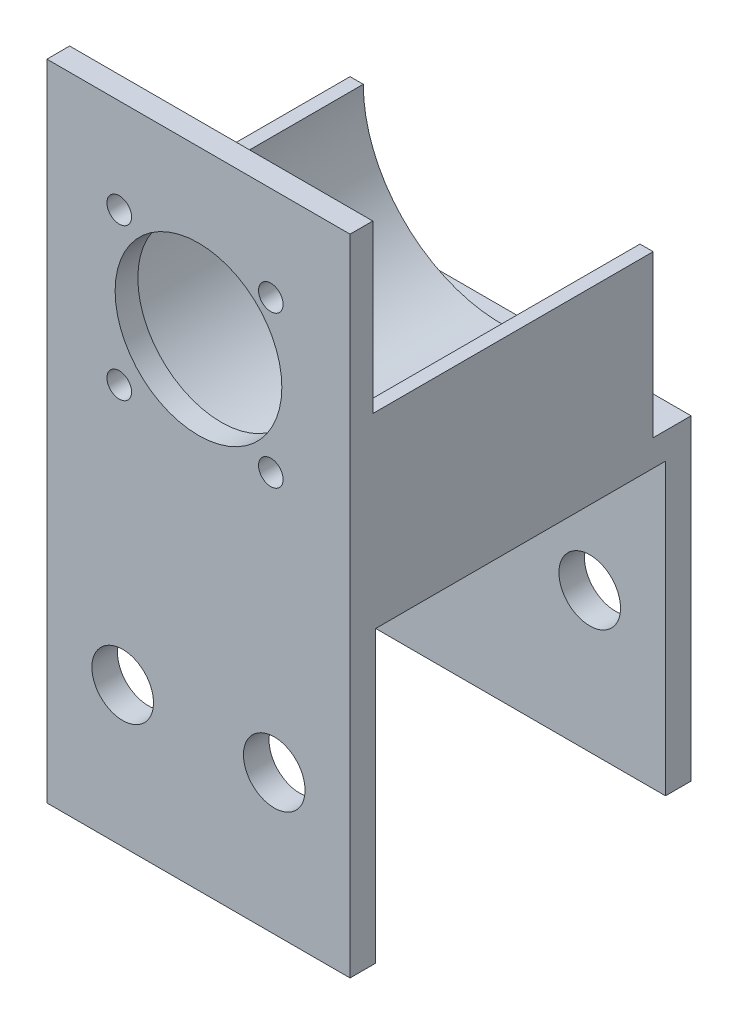
ISO-10303-21;
HEADER;
FILE_DESCRIPTION(('STEP AP214'),'2;1');
FILE_NAME('part.step','',(''),(''),'','','');
FILE_SCHEMA(('AUTOMOTIVE_DESIGN { 1 0 10303 214 1 1 1 1 }'));
ENDSEC;
DATA;
#1=APPLICATION_CONTEXT('core data for automotive mechanical design processes');
#2=APPLICATION_PROTOCOL_DEFINITION('international standard','automotive_design',2000,#1);
#3=PRODUCT_CONTEXT('',#1,'mechanical');
#4=PRODUCT('Part','Part','',(#3));
#5=PRODUCT_RELATED_PRODUCT_CATEGORY('part','',(#4));
#6=PRODUCT_DEFINITION_FORMATION('','',#4);
#7=PRODUCT_DEFINITION_CONTEXT('part definition',#1,'design');
#8=PRODUCT_DEFINITION('design','',#6,#7);
#9=PRODUCT_DEFINITION_SHAPE('','',#8);
#10=(LENGTH_UNIT() NAMED_UNIT(*) SI_UNIT(.MILLI.,.METRE.));
#11=(NAMED_UNIT(*) PLANE_ANGLE_UNIT() SI_UNIT($,.RADIAN.));
#12=(NAMED_UNIT(*) SI_UNIT($,.STERADIAN.) SOLID_ANGLE_UNIT());
#13=UNCERTAINTY_MEASURE_WITH_UNIT(LENGTH_MEASURE(1.E-05),#10,'distance_accuracy_value','');
#14=(GEOMETRIC_REPRESENTATION_CONTEXT(3) GLOBAL_UNCERTAINTY_ASSIGNED_CONTEXT((#13)) GLOBAL_UNIT_ASSIGNED_CONTEXT((#10,
#11,#12)) REPRESENTATION_CONTEXT('',''));
#15=CARTESIAN_POINT('',(0.,0.,0.));
#16=DIRECTION('',(0.,0.,1.));
#17=DIRECTION('',(1.,0.,0.));
#18=AXIS2_PLACEMENT_3D('',#15,#16,#17);
#19=CARTESIAN_POINT('',(40.,63.,0.));
#20=DIRECTION('',(0.,1.,0.));
#21=DIRECTION('',(0.,0.,1.));
#22=AXIS2_PLACEMENT_3D('',#19,#20,#21);
#23=PLANE('',#22);
#24=DIRECTION('',(-1.,0.,0.));
#25=VECTOR('',#24,1.);
#26=CARTESIAN_POINT('',(40.,63.,5.00000000000001));
#27=LINE('',#26,#25);
#28=CARTESIAN_POINT('',(40.,63.,5.00000000000001));
#29=VERTEX_POINT('',#28);
#30=CARTESIAN_POINT('',(38.25625,63.,5.));
#31=VERTEX_POINT('',#30);
#32=EDGE_CURVE('E377',#29,#31,#27,.T.);
#33=ORIENTED_EDGE('',*,*,#32,.T.);
#34=DIRECTION('',(0.,0.,-1.));
#35=VECTOR('',#34,1.);
#36=CARTESIAN_POINT('',(38.25625,63.,93.6364726961476));
#37=LINE('',#36,#35);
#38=CARTESIAN_POINT('',(38.25625,63.,42.));
#39=VERTEX_POINT('',#38);
#40=EDGE_CURVE('E50',#31,#39,#37,.F.);
#41=ORIENTED_EDGE('',*,*,#40,.T.);
#42=DIRECTION('',(-1.,0.,0.));
#43=VECTOR('',#42,1.);
#44=CARTESIAN_POINT('',(40.,63.,42.));
#45=LINE('',#44,#43);
#46=CARTESIAN_POINT('',(40.,63.,42.));
#47=VERTEX_POINT('',#46);
#48=EDGE_CURVE('E289',#47,#39,#45,.T.);
#49=ORIENTED_EDGE('',*,*,#48,.F.);
#50=DIRECTION('',(0.,0.,-1.));
#51=VECTOR('',#50,1.);
#52=CARTESIAN_POINT('',(40.,63.,0.));
#53=LINE('',#52,#51);
#54=EDGE_CURVE('E277',#47,#29,#53,.T.);
#55=ORIENTED_EDGE('',*,*,#54,.T.);
#56=EDGE_LOOP('',(#33,#41,#49,#55));
#57=FACE_BOUND('',#56,.T.);
#58=ADVANCED_FACE('F41',(#57),#23,.T.);
#59=CARTESIAN_POINT('',(1.74375,63.,5.));
#60=VERTEX_POINT('',#59);
#61=CARTESIAN_POINT('',(0.,63.,5.00000000000001));
#62=VERTEX_POINT('',#61);
#63=EDGE_CURVE('E56',#60,#62,#27,.T.);
#64=ORIENTED_EDGE('',*,*,#63,.T.);
#65=DIRECTION('',(0.,0.,-1.));
#66=VECTOR('',#65,1.);
#67=CARTESIAN_POINT('',(0.,63.,0.));
#68=LINE('',#67,#66);
#69=CARTESIAN_POINT('',(0.,63.,42.));
#70=VERTEX_POINT('',#69);
#71=EDGE_CURVE('E278',#70,#62,#68,.T.);
#72=ORIENTED_EDGE('',*,*,#71,.F.);
#73=CARTESIAN_POINT('',(1.74375,63.,42.));
#74=VERTEX_POINT('',#73);
#75=EDGE_CURVE('E282',#74,#70,#45,.T.);
#76=ORIENTED_EDGE('',*,*,#75,.F.);
#77=DIRECTION('',(0.,0.,-1.));
#78=VECTOR('',#77,1.);
#79=CARTESIAN_POINT('',(1.74375,63.,93.6364726961476));
#80=LINE('',#79,#78);
#81=EDGE_CURVE('E202',#74,#60,#80,.T.);
#82=ORIENTED_EDGE('',*,*,#81,.T.);
#83=EDGE_LOOP('',(#64,#72,#76,#82));
#84=FACE_BOUND('',#83,.T.);
#85=ADVANCED_FACE('F384',(#84),#23,.T.);
#86=CARTESIAN_POINT('',(0.,0.,45.));
#87=DIRECTION('',(1.,0.,0.));
#88=DIRECTION('',(0.,0.,-1.));
#89=AXIS2_PLACEMENT_3D('',#86,#87,#88);
#90=PLANE('',#89);
#91=ORIENTED_EDGE('',*,*,#71,.T.);
#92=DIRECTION('',(0.,1.,0.));
#93=VECTOR('',#92,1.);
#94=CARTESIAN_POINT('',(0.,63.,5.00000000000001));
#95=LINE('',#94,#93);
#96=CARTESIAN_POINT('',(0.,41.74375,5.00000000000001));
#97=VERTEX_POINT('',#96);
#98=EDGE_CURVE('E155',#97,#62,#95,.T.);
#99=ORIENTED_EDGE('',*,*,#98,.F.);
#100=DIRECTION('',(0.,0.,1.));
#101=VECTOR('',#100,1.);
#102=CARTESIAN_POINT('',(0.,41.74375,0.));
#103=LINE('',#102,#101);
#104=CARTESIAN_POINT('',(0.,41.74375,0.));
#105=VERTEX_POINT('',#104);
#106=EDGE_CURVE('E343',#105,#97,#103,.T.);
#107=ORIENTED_EDGE('',*,*,#106,.F.);
#108=DIRECTION('',(0.,-1.,0.));
#109=VECTOR('',#108,1.);
#110=CARTESIAN_POINT('',(0.,0.,0.));
#111=LINE('',#110,#109);
#112=CARTESIAN_POINT('',(0.,0.,0.));
#113=VERTEX_POINT('',#112);
#114=EDGE_CURVE('E164',#105,#113,#111,.T.);
#115=ORIENTED_EDGE('',*,*,#114,.T.);
#116=DIRECTION('',(0.,0.,-1.));
#117=VECTOR('',#116,1.);
#118=CARTESIAN_POINT('',(0.,0.,45.));
#119=LINE('',#118,#117);
#120=CARTESIAN_POINT('',(0.,0.,3.375));
#121=VERTEX_POINT('',#120);
#122=EDGE_CURVE('E197',#121,#113,#119,.T.);
#123=ORIENTED_EDGE('',*,*,#122,.F.);
#124=DIRECTION('',(0.,1.,0.));
#125=VECTOR('',#124,1.);
#126=CARTESIAN_POINT('',(0.,0.,3.375));
#127=LINE('',#126,#125);
#128=CARTESIAN_POINT('',(0.,38.25,3.375));
#129=VERTEX_POINT('',#128);
#130=EDGE_CURVE('E311',#121,#129,#127,.T.);
#131=ORIENTED_EDGE('',*,*,#130,.T.);
#132=DIRECTION('',(0.,0.,1.));
#133=VECTOR('',#132,1.);
#134=CARTESIAN_POINT('',(0.,38.25,45.));
#135=LINE('',#134,#133);
#136=CARTESIAN_POINT('',(0.,38.25,41.625));
#137=VERTEX_POINT('',#136);
#138=EDGE_CURVE('E324',#129,#137,#135,.T.);
#139=ORIENTED_EDGE('',*,*,#138,.T.);
#140=DIRECTION('',(0.,-1.,0.));
#141=VECTOR('',#140,1.);
#142=CARTESIAN_POINT('',(0.,0.,41.625));
#143=LINE('',#142,#141);
#144=CARTESIAN_POINT('',(0.,0.,41.625));
#145=VERTEX_POINT('',#144);
#146=EDGE_CURVE('E328',#137,#145,#143,.T.);
#147=ORIENTED_EDGE('',*,*,#146,.T.);
#148=CARTESIAN_POINT('',(0.,0.,45.));
#149=VERTEX_POINT('',#148);
#150=EDGE_CURVE('E198',#149,#145,#119,.T.);
#151=ORIENTED_EDGE('',*,*,#150,.F.);
#152=DIRECTION('',(0.,-1.,0.));
#153=VECTOR('',#152,1.);
#154=CARTESIAN_POINT('',(0.,0.,45.));
#155=LINE('',#154,#153);
#156=CARTESIAN_POINT('',(0.,85.,45.));
#157=VERTEX_POINT('',#156);
#158=EDGE_CURVE('E173',#157,#149,#155,.T.);
#159=ORIENTED_EDGE('',*,*,#158,.F.);
#160=DIRECTION('',(0.,0.,-1.));
#161=VECTOR('',#160,1.);
#162=CARTESIAN_POINT('',(0.,85.,45.));
#163=LINE('',#162,#161);
#164=CARTESIAN_POINT('',(0.,85.,42.));
#165=VERTEX_POINT('',#164);
#166=EDGE_CURVE('E184',#157,#165,#163,.T.);
#167=ORIENTED_EDGE('',*,*,#166,.T.);
#168=DIRECTION('',(0.,-1.,0.));
#169=VECTOR('',#168,1.);
#170=CARTESIAN_POINT('',(0.,85.,42.));
#171=LINE('',#170,#169);
#172=EDGE_CURVE('E273',#165,#70,#171,.T.);
#173=ORIENTED_EDGE('',*,*,#172,.T.);
#174=EDGE_LOOP('',(#91,#99,#107,#115,#123,#131,#139,#147,#151,#159,#167,#173));
#175=FACE_BOUND('',#174,.T.);
#176=ADVANCED_FACE('F43',(#175),#90,.F.);
#177=CARTESIAN_POINT('',(40.,0.,45.));
#178=DIRECTION('',(-1.,0.,0.));
#179=DIRECTION('',(0.,0.,1.));
#180=AXIS2_PLACEMENT_3D('',#177,#178,#179);
#181=PLANE('',#180);
#182=DIRECTION('',(0.,0.,1.));
#183=VECTOR('',#182,1.);
#184=CARTESIAN_POINT('',(40.,41.74375,0.));
#185=LINE('',#184,#183);
#186=CARTESIAN_POINT('',(40.,41.74375,0.));
#187=VERTEX_POINT('',#186);
#188=CARTESIAN_POINT('',(40.,41.74375,5.00000000000001));
#189=VERTEX_POINT('',#188);
#190=EDGE_CURVE('E142',#187,#189,#185,.T.);
#191=ORIENTED_EDGE('',*,*,#190,.T.);
#192=DIRECTION('',(0.,1.,0.));
#193=VECTOR('',#192,1.);
#194=CARTESIAN_POINT('',(40.,63.,5.00000000000001));
#195=LINE('',#194,#193);
#196=EDGE_CURVE('E154',#189,#29,#195,.T.);
#197=ORIENTED_EDGE('',*,*,#196,.T.);
#198=ORIENTED_EDGE('',*,*,#54,.F.);
#199=DIRECTION('',(0.,-1.,0.));
#200=VECTOR('',#199,1.);
#201=CARTESIAN_POINT('',(40.,85.,42.));
#202=LINE('',#201,#200);
#203=CARTESIAN_POINT('',(40.,85.,42.));
#204=VERTEX_POINT('',#203);
#205=EDGE_CURVE('E274',#204,#47,#202,.T.);
#206=ORIENTED_EDGE('',*,*,#205,.F.);
#207=DIRECTION('',(0.,0.,-1.));
#208=VECTOR('',#207,1.);
#209=CARTESIAN_POINT('',(40.,85.,45.));
#210=LINE('',#209,#208);
#211=CARTESIAN_POINT('',(40.,85.,45.));
#212=VERTEX_POINT('',#211);
#213=EDGE_CURVE('E188',#212,#204,#210,.T.);
#214=ORIENTED_EDGE('',*,*,#213,.F.);
#215=DIRECTION('',(0.,1.,0.));
#216=VECTOR('',#215,1.);
#217=CARTESIAN_POINT('',(40.,0.,45.));
#218=LINE('',#217,#216);
#219=CARTESIAN_POINT('',(40.,0.,45.));
#220=VERTEX_POINT('',#219);
#221=EDGE_CURVE('E334',#220,#212,#218,.T.);
#222=ORIENTED_EDGE('',*,*,#221,.F.);
#223=DIRECTION('',(0.,0.,-1.));
#224=VECTOR('',#223,1.);
#225=CARTESIAN_POINT('',(40.,0.,45.));
#226=LINE('',#225,#224);
#227=CARTESIAN_POINT('',(40.,0.,41.625));
#228=VERTEX_POINT('',#227);
#229=EDGE_CURVE('E193',#220,#228,#226,.T.);
#230=ORIENTED_EDGE('',*,*,#229,.T.);
#231=DIRECTION('',(0.,-1.,0.));
#232=VECTOR('',#231,1.);
#233=CARTESIAN_POINT('',(40.,0.,41.625));
#234=LINE('',#233,#232);
#235=CARTESIAN_POINT('',(40.,38.25,41.625));
#236=VERTEX_POINT('',#235);
#237=EDGE_CURVE('E296',#236,#228,#234,.T.);
#238=ORIENTED_EDGE('',*,*,#237,.F.);
#239=DIRECTION('',(0.,0.,1.));
#240=VECTOR('',#239,1.);
#241=CARTESIAN_POINT('',(40.,38.25,41.625));
#242=LINE('',#241,#240);
#243=CARTESIAN_POINT('',(40.,38.25,3.375));
#244=VERTEX_POINT('',#243);
#245=EDGE_CURVE('E303',#244,#236,#242,.T.);
#246=ORIENTED_EDGE('',*,*,#245,.F.);
#247=DIRECTION('',(0.,1.,0.));
#248=VECTOR('',#247,1.);
#249=CARTESIAN_POINT('',(40.,0.,3.375));
#250=LINE('',#249,#248);
#251=CARTESIAN_POINT('',(40.,0.,3.37500000000001));
#252=VERTEX_POINT('',#251);
#253=EDGE_CURVE('E299',#252,#244,#250,.T.);
#254=ORIENTED_EDGE('',*,*,#253,.F.);
#255=CARTESIAN_POINT('',(40.,0.,0.));
#256=VERTEX_POINT('',#255);
#257=EDGE_CURVE('E170',#252,#256,#226,.T.);
#258=ORIENTED_EDGE('',*,*,#257,.T.);
#259=DIRECTION('',(0.,1.,0.));
#260=VECTOR('',#259,1.);
#261=CARTESIAN_POINT('',(40.,0.,0.));
#262=LINE('',#261,#260);
#263=EDGE_CURVE('E163',#256,#187,#262,.T.);
#264=ORIENTED_EDGE('',*,*,#263,.T.);
#265=EDGE_LOOP('',(#191,#197,#198,#206,#214,#222,#230,#238,#246,#254,#258,#264));
#266=FACE_BOUND('',#265,.T.);
#267=ADVANCED_FACE('F167',(#266),#181,.F.);
#268=CARTESIAN_POINT('',(0.,85.,45.));
#269=DIRECTION('',(0.,-1.,0.));
#270=DIRECTION('',(0.,0.,-1.));
#271=AXIS2_PLACEMENT_3D('',#268,#269,#270);
#272=PLANE('',#271);
#273=DIRECTION('',(-1.,0.,0.));
#274=VECTOR('',#273,1.);
#275=CARTESIAN_POINT('',(40.,85.,42.));
#276=LINE('',#275,#274);
#277=EDGE_CURVE('E292',#204,#165,#276,.T.);
#278=ORIENTED_EDGE('',*,*,#277,.T.);
#279=ORIENTED_EDGE('',*,*,#166,.F.);
#280=DIRECTION('',(-1.,0.,0.));
#281=VECTOR('',#280,1.);
#282=CARTESIAN_POINT('',(0.,85.,45.));
#283=LINE('',#282,#281);
#284=EDGE_CURVE('E189',#212,#157,#283,.T.);
#285=ORIENTED_EDGE('',*,*,#284,.F.);
#286=ORIENTED_EDGE('',*,*,#213,.T.);
#287=EDGE_LOOP('',(#278,#279,#285,#286));
#288=FACE_BOUND('',#287,.T.);
#289=ADVANCED_FACE('F369',(#288),#272,.F.);
#290=CARTESIAN_POINT('',(0.,0.,0.));
#291=DIRECTION('',(0.,0.,-1.));
#292=DIRECTION('',(-1.,0.,0.));
#293=AXIS2_PLACEMENT_3D('',#290,#291,#292);
#294=PLANE('',#293);
#295=DIRECTION('',(-1.,0.,0.));
#296=VECTOR('',#295,1.);
#297=CARTESIAN_POINT('',(40.,41.74375,0.));
#298=LINE('',#297,#296);
#299=EDGE_CURVE('E146',#187,#105,#298,.T.);
#300=ORIENTED_EDGE('',*,*,#299,.F.);
#301=ORIENTED_EDGE('',*,*,#263,.F.);
#302=DIRECTION('',(1.,0.,0.));
#303=VECTOR('',#302,1.);
#304=CARTESIAN_POINT('',(0.,0.,0.));
#305=LINE('',#304,#303);
#306=EDGE_CURVE('E174',#113,#256,#305,.T.);
#307=ORIENTED_EDGE('',*,*,#306,.F.);
#308=ORIENTED_EDGE('',*,*,#114,.F.);
#309=EDGE_LOOP('',(#300,#301,#307,#308));
#310=FACE_BOUND('',#309,.T.);
#311=CARTESIAN_POINT('',(10.,18.4875,0.));
#312=DIRECTION('',(0.,0.,-1.));
#313=DIRECTION('',(-1.,0.,0.));
#314=AXIS2_PLACEMENT_3D('',#311,#312,#313);
#315=CIRCLE('',#314,4.065);
#316=CARTESIAN_POINT('',(5.935,18.4875,0.));
#317=VERTEX_POINT('',#316);
#318=EDGE_CURVE('E397',#317,#317,#315,.T.);
#319=ORIENTED_EDGE('',*,*,#318,.F.);
#320=EDGE_LOOP('',(#319));
#321=FACE_BOUND('',#320,.T.);
#322=CARTESIAN_POINT('',(30.,18.4875,0.));
#323=DIRECTION('',(0.,0.,-1.));
#324=DIRECTION('',(-1.,0.,0.));
#325=AXIS2_PLACEMENT_3D('',#322,#323,#324);
#326=CIRCLE('',#325,4.065);
#327=CARTESIAN_POINT('',(25.935,18.4875,0.));
#328=VERTEX_POINT('',#327);
#329=EDGE_CURVE('E394',#328,#328,#326,.T.);
#330=ORIENTED_EDGE('',*,*,#329,.F.);
#331=EDGE_LOOP('',(#330));
#332=FACE_BOUND('',#331,.T.);
#333=ADVANCED_FACE('F160',(#310,#321,#332),#294,.T.);
#334=CARTESIAN_POINT('',(0.,0.,45.));
#335=DIRECTION('',(0.,1.,0.));
#336=DIRECTION('',(0.,0.,1.));
#337=AXIS2_PLACEMENT_3D('',#334,#335,#336);
#338=PLANE('',#337);
#339=ORIENTED_EDGE('',*,*,#150,.T.);
#340=DIRECTION('',(1.,0.,0.));
#341=VECTOR('',#340,1.);
#342=CARTESIAN_POINT('',(-1.1,0.,41.625));
#343=LINE('',#342,#341);
#344=EDGE_CURVE('E307',#145,#228,#343,.T.);
#345=ORIENTED_EDGE('',*,*,#344,.T.);
#346=ORIENTED_EDGE('',*,*,#229,.F.);
#347=DIRECTION('',(1.,0.,0.));
#348=VECTOR('',#347,1.);
#349=CARTESIAN_POINT('',(0.,0.,45.));
#350=LINE('',#349,#348);
#351=EDGE_CURVE('E179',#149,#220,#350,.T.);
#352=ORIENTED_EDGE('',*,*,#351,.F.);
#353=EDGE_LOOP('',(#339,#345,#346,#352));
#354=FACE_BOUND('',#353,.T.);
#355=ADVANCED_FACE('F361',(#354),#338,.F.);
#356=ORIENTED_EDGE('',*,*,#257,.F.);
#357=DIRECTION('',(1.,0.,0.));
#358=VECTOR('',#357,1.);
#359=CARTESIAN_POINT('',(-1.1,0.,3.375));
#360=LINE('',#359,#358);
#361=EDGE_CURVE('E315',#121,#252,#360,.T.);
#362=ORIENTED_EDGE('',*,*,#361,.F.);
#363=ORIENTED_EDGE('',*,*,#122,.T.);
#364=ORIENTED_EDGE('',*,*,#306,.T.);
#365=EDGE_LOOP('',(#356,#362,#363,#364));
#366=FACE_BOUND('',#365,.T.);
#367=ADVANCED_FACE('F346',(#366),#338,.F.);
#368=CARTESIAN_POINT('',(0.,0.,45.));
#369=DIRECTION('',(0.,0.,-1.));
#370=DIRECTION('',(-1.,0.,0.));
#371=AXIS2_PLACEMENT_3D('',#368,#369,#370);
#372=PLANE('',#371);
#373=CARTESIAN_POINT('',(10.,18.4875,45.));
#374=DIRECTION('',(0.,0.,-1.));
#375=DIRECTION('',(-1.,0.,0.));
#376=AXIS2_PLACEMENT_3D('',#373,#374,#375);
#377=CIRCLE('',#376,4.065);
#378=CARTESIAN_POINT('',(5.935,18.4875,45.));
#379=VERTEX_POINT('',#378);
#380=EDGE_CURVE('E217',#379,#379,#377,.T.);
#381=ORIENTED_EDGE('',*,*,#380,.T.);
#382=EDGE_LOOP('',(#381));
#383=FACE_BOUND('',#382,.T.);
#384=CARTESIAN_POINT('',(30.,18.4875,45.));
#385=DIRECTION('',(0.,0.,-1.));
#386=DIRECTION('',(-1.,0.,0.));
#387=AXIS2_PLACEMENT_3D('',#384,#385,#386);
#388=CIRCLE('',#387,4.065);
#389=CARTESIAN_POINT('',(25.935,18.4875,45.));
#390=VERTEX_POINT('',#389);
#391=EDGE_CURVE('E234',#390,#390,#388,.T.);
#392=ORIENTED_EDGE('',*,*,#391,.T.);
#393=EDGE_LOOP('',(#392));
#394=FACE_BOUND('',#393,.T.);
#395=CARTESIAN_POINT('',(29.5459415460185,52.5459415460183,45.));
#396=DIRECTION('',(0.,0.,-1.));
#397=DIRECTION('',(-1.,0.,0.));
#398=AXIS2_PLACEMENT_3D('',#395,#396,#397);
#399=CIRCLE('',#398,1.625);
#400=CARTESIAN_POINT('',(27.9209415460184,52.5459415460183,45.));
#401=VERTEX_POINT('',#400);
#402=EDGE_CURVE('E250',#401,#401,#399,.T.);
#403=ORIENTED_EDGE('',*,*,#402,.T.);
#404=EDGE_LOOP('',(#403));
#405=FACE_BOUND('',#404,.T.);
#406=CARTESIAN_POINT('',(9.54594154601845,72.5459415460183,45.));
#407=DIRECTION('',(0.,0.,-1.));
#408=DIRECTION('',(-1.,0.,0.));
#409=AXIS2_PLACEMENT_3D('',#406,#407,#408);
#410=CIRCLE('',#409,1.62499999999998);
#411=CARTESIAN_POINT('',(7.92094154601847,72.5459415460183,45.));
#412=VERTEX_POINT('',#411);
#413=EDGE_CURVE('E241',#412,#412,#410,.T.);
#414=ORIENTED_EDGE('',*,*,#413,.T.);
#415=EDGE_LOOP('',(#414));
#416=FACE_BOUND('',#415,.T.);
#417=CARTESIAN_POINT('',(9.54594154601845,52.5459415460183,45.));
#418=DIRECTION('',(0.,0.,-1.));
#419=DIRECTION('',(-1.,0.,0.));
#420=AXIS2_PLACEMENT_3D('',#417,#418,#419);
#421=CIRCLE('',#420,1.625);
#422=CARTESIAN_POINT('',(7.92094154601845,52.5459415460183,45.));
#423=VERTEX_POINT('',#422);
#424=EDGE_CURVE('E227',#423,#423,#421,.T.);
#425=ORIENTED_EDGE('',*,*,#424,.T.);
#426=EDGE_LOOP('',(#425));
#427=FACE_BOUND('',#426,.T.);
#428=CARTESIAN_POINT('',(29.5459415460185,72.5459415460183,45.));
#429=DIRECTION('',(0.,0.,-1.));
#430=DIRECTION('',(-1.,0.,0.));
#431=AXIS2_PLACEMENT_3D('',#428,#429,#430);
#432=CIRCLE('',#431,1.62500000000001);
#433=CARTESIAN_POINT('',(27.9209415460184,72.5459415460183,45.));
#434=VERTEX_POINT('',#433);
#435=EDGE_CURVE('E261',#434,#434,#432,.T.);
#436=ORIENTED_EDGE('',*,*,#435,.T.);
#437=EDGE_LOOP('',(#436));
#438=FACE_BOUND('',#437,.T.);
#439=CARTESIAN_POINT('',(20.,63.,45.));
#440=DIRECTION('',(0.,0.,-1.));
#441=DIRECTION('',(-1.,0.,0.));
#442=AXIS2_PLACEMENT_3D('',#439,#440,#441);
#443=CIRCLE('',#442,11.);
#444=CARTESIAN_POINT('',(9.,63.,45.));
#445=VERTEX_POINT('',#444);
#446=EDGE_CURVE('E212',#445,#445,#443,.T.);
#447=ORIENTED_EDGE('',*,*,#446,.T.);
#448=EDGE_LOOP('',(#447));
#449=FACE_BOUND('',#448,.T.);
#450=ORIENTED_EDGE('',*,*,#158,.T.);
#451=ORIENTED_EDGE('',*,*,#351,.T.);
#452=ORIENTED_EDGE('',*,*,#221,.T.);
#453=ORIENTED_EDGE('',*,*,#284,.T.);
#454=EDGE_LOOP('',(#450,#451,#452,#453));
#455=FACE_BOUND('',#454,.T.);
#456=ADVANCED_FACE('F365',(#383,#394,#405,#416,#427,#438,#449,#455),#372,.F.);
#457=CARTESIAN_POINT('',(-1.1,0.,41.625));
#458=DIRECTION('',(0.,0.,1.));
#459=DIRECTION('',(1.,0.,0.));
#460=AXIS2_PLACEMENT_3D('',#457,#458,#459);
#461=PLANE('',#460);
#462=CARTESIAN_POINT('',(10.,18.4875,41.625));
#463=DIRECTION('',(0.,0.,1.));
#464=DIRECTION('',(1.,0.,0.));
#465=AXIS2_PLACEMENT_3D('',#462,#463,#464);
#466=CIRCLE('',#465,4.065);
#467=CARTESIAN_POINT('',(14.065,18.4875,41.625));
#468=VERTEX_POINT('',#467);
#469=EDGE_CURVE('E221',#468,#468,#466,.T.);
#470=ORIENTED_EDGE('',*,*,#469,.T.);
#471=EDGE_LOOP('',(#470));
#472=FACE_BOUND('',#471,.T.);
#473=CARTESIAN_POINT('',(30.,18.4875,41.625));
#474=DIRECTION('',(0.,0.,1.));
#475=DIRECTION('',(1.,0.,0.));
#476=AXIS2_PLACEMENT_3D('',#473,#474,#475);
#477=CIRCLE('',#476,4.065);
#478=CARTESIAN_POINT('',(34.065,18.4875,41.625));
#479=VERTEX_POINT('',#478);
#480=EDGE_CURVE('E216',#479,#479,#477,.T.);
#481=ORIENTED_EDGE('',*,*,#480,.T.);
#482=EDGE_LOOP('',(#481));
#483=FACE_BOUND('',#482,.T.);
#484=DIRECTION('',(1.,0.,0.));
#485=VECTOR('',#484,1.);
#486=CARTESIAN_POINT('',(-1.1,38.25,41.625));
#487=LINE('',#486,#485);
#488=EDGE_CURVE('E308',#137,#236,#487,.T.);
#489=ORIENTED_EDGE('',*,*,#488,.T.);
#490=ORIENTED_EDGE('',*,*,#237,.T.);
#491=ORIENTED_EDGE('',*,*,#344,.F.);
#492=ORIENTED_EDGE('',*,*,#146,.F.);
#493=EDGE_LOOP('',(#489,#490,#491,#492));
#494=FACE_BOUND('',#493,.T.);
#495=ADVANCED_FACE('F444',(#472,#483,#494),#461,.F.);
#496=CARTESIAN_POINT('',(-1.1,38.25,41.625));
#497=DIRECTION('',(0.,1.,0.));
#498=DIRECTION('',(0.,0.,1.));
#499=AXIS2_PLACEMENT_3D('',#496,#497,#498);
#500=PLANE('',#499);
#501=DIRECTION('',(1.,0.,0.));
#502=VECTOR('',#501,1.);
#503=CARTESIAN_POINT('',(-1.1,38.25,3.375));
#504=LINE('',#503,#502);
#505=EDGE_CURVE('E312',#129,#244,#504,.T.);
#506=ORIENTED_EDGE('',*,*,#505,.T.);
#507=ORIENTED_EDGE('',*,*,#245,.T.);
#508=ORIENTED_EDGE('',*,*,#488,.F.);
#509=ORIENTED_EDGE('',*,*,#138,.F.);
#510=EDGE_LOOP('',(#506,#507,#508,#509));
#511=FACE_BOUND('',#510,.T.);
#512=ADVANCED_FACE('F356',(#511),#500,.F.);
#513=CARTESIAN_POINT('',(-1.1,0.,3.375));
#514=DIRECTION('',(0.,0.,-1.));
#515=DIRECTION('',(-1.,0.,0.));
#516=AXIS2_PLACEMENT_3D('',#513,#514,#515);
#517=PLANE('',#516);
#518=CARTESIAN_POINT('',(10.,18.4875,3.375));
#519=DIRECTION('',(0.,0.,-1.));
#520=DIRECTION('',(-1.,0.,0.));
#521=AXIS2_PLACEMENT_3D('',#518,#519,#520);
#522=CIRCLE('',#521,4.065);
#523=CARTESIAN_POINT('',(5.935,18.4875,3.375));
#524=VERTEX_POINT('',#523);
#525=EDGE_CURVE('E218',#524,#524,#522,.T.);
#526=ORIENTED_EDGE('',*,*,#525,.T.);
#527=EDGE_LOOP('',(#526));
#528=FACE_BOUND('',#527,.T.);
#529=CARTESIAN_POINT('',(30.,18.4875,3.375));
#530=DIRECTION('',(0.,0.,-1.));
#531=DIRECTION('',(-1.,0.,0.));
#532=AXIS2_PLACEMENT_3D('',#529,#530,#531);
#533=CIRCLE('',#532,4.065);
#534=CARTESIAN_POINT('',(25.935,18.4875,3.375));
#535=VERTEX_POINT('',#534);
#536=EDGE_CURVE('E213',#535,#535,#533,.T.);
#537=ORIENTED_EDGE('',*,*,#536,.T.);
#538=EDGE_LOOP('',(#537));
#539=FACE_BOUND('',#538,.T.);
#540=ORIENTED_EDGE('',*,*,#361,.T.);
#541=ORIENTED_EDGE('',*,*,#253,.T.);
#542=ORIENTED_EDGE('',*,*,#505,.F.);
#543=ORIENTED_EDGE('',*,*,#130,.F.);
#544=EDGE_LOOP('',(#540,#541,#542,#543));
#545=FACE_BOUND('',#544,.T.);
#546=ADVANCED_FACE('F350',(#528,#539,#545),#517,.F.);
#547=CARTESIAN_POINT('',(40.,85.,42.));
#548=DIRECTION('',(0.,0.,-1.));
#549=DIRECTION('',(-1.,0.,0.));
#550=AXIS2_PLACEMENT_3D('',#547,#548,#549);
#551=PLANE('',#550);
#552=CARTESIAN_POINT('',(29.5459415460185,52.5459415460183,42.));
#553=DIRECTION('',(0.,0.,-1.));
#554=DIRECTION('',(-1.,0.,0.));
#555=AXIS2_PLACEMENT_3D('',#552,#553,#554);
#556=CIRCLE('',#555,1.625);
#557=CARTESIAN_POINT('',(27.9209415460184,52.5459415460183,42.));
#558=VERTEX_POINT('',#557);
#559=EDGE_CURVE('E245',#558,#558,#556,.T.);
#560=ORIENTED_EDGE('',*,*,#559,.F.);
#561=EDGE_LOOP('',(#560));
#562=FACE_BOUND('',#561,.T.);
#563=CARTESIAN_POINT('',(9.54594154601845,72.5459415460183,42.));
#564=DIRECTION('',(0.,0.,-1.));
#565=DIRECTION('',(-1.,0.,0.));
#566=AXIS2_PLACEMENT_3D('',#563,#564,#565);
#567=CIRCLE('',#566,1.62499999999998);
#568=CARTESIAN_POINT('',(7.92094154601847,72.5459415460183,42.));
#569=VERTEX_POINT('',#568);
#570=EDGE_CURVE('E254',#569,#569,#567,.T.);
#571=ORIENTED_EDGE('',*,*,#570,.F.);
#572=EDGE_LOOP('',(#571));
#573=FACE_BOUND('',#572,.T.);
#574=CARTESIAN_POINT('',(9.54594154601845,52.5459415460183,42.));
#575=DIRECTION('',(0.,0.,-1.));
#576=DIRECTION('',(-1.,0.,0.));
#577=AXIS2_PLACEMENT_3D('',#574,#575,#576);
#578=CIRCLE('',#577,1.625);
#579=CARTESIAN_POINT('',(7.92094154601845,52.5459415460183,42.));
#580=VERTEX_POINT('',#579);
#581=EDGE_CURVE('E237',#580,#580,#578,.T.);
#582=ORIENTED_EDGE('',*,*,#581,.F.);
#583=EDGE_LOOP('',(#582));
#584=FACE_BOUND('',#583,.T.);
#585=CARTESIAN_POINT('',(29.5459415460185,72.5459415460183,42.));
#586=DIRECTION('',(0.,0.,-1.));
#587=DIRECTION('',(-1.,0.,0.));
#588=AXIS2_PLACEMENT_3D('',#585,#586,#587);
#589=CIRCLE('',#588,1.62500000000001);
#590=CARTESIAN_POINT('',(27.9209415460184,72.5459415460183,42.));
#591=VERTEX_POINT('',#590);
#592=EDGE_CURVE('E249',#591,#591,#589,.T.);
#593=ORIENTED_EDGE('',*,*,#592,.F.);
#594=EDGE_LOOP('',(#593));
#595=FACE_BOUND('',#594,.T.);
#596=CARTESIAN_POINT('',(20.,63.,42.));
#597=DIRECTION('',(0.,0.,-1.));
#598=DIRECTION('',(-1.,0.,0.));
#599=AXIS2_PLACEMENT_3D('',#596,#597,#598);
#600=CIRCLE('',#599,11.);
#601=CARTESIAN_POINT('',(9.,63.,42.));
#602=VERTEX_POINT('',#601);
#603=EDGE_CURVE('E208',#602,#602,#600,.T.);
#604=ORIENTED_EDGE('',*,*,#603,.F.);
#605=EDGE_LOOP('',(#604));
#606=FACE_BOUND('',#605,.T.);
#607=ORIENTED_EDGE('',*,*,#48,.T.);
#608=CARTESIAN_POINT('',(20.,63.,42.));
#609=DIRECTION('',(0.,0.,-1.));
#610=DIRECTION('',(-1.,0.,0.));
#611=AXIS2_PLACEMENT_3D('',#608,#609,#610);
#612=CIRCLE('',#611,18.25625);
#613=EDGE_CURVE('E64',#39,#74,#612,.T.);
#614=ORIENTED_EDGE('',*,*,#613,.T.);
#615=ORIENTED_EDGE('',*,*,#75,.T.);
#616=ORIENTED_EDGE('',*,*,#172,.F.);
#617=ORIENTED_EDGE('',*,*,#277,.F.);
#618=ORIENTED_EDGE('',*,*,#205,.T.);
#619=EDGE_LOOP('',(#607,#614,#615,#616,#617,#618));
#620=FACE_BOUND('',#619,.T.);
#621=ADVANCED_FACE('F372',(#562,#573,#584,#595,#606,#620),#551,.T.);
#622=CARTESIAN_POINT('',(20.,63.,93.6364726961476));
#623=DIRECTION('',(0.,0.,-1.));
#624=DIRECTION('',(-1.,0.,0.));
#625=AXIS2_PLACEMENT_3D('',#622,#623,#624);
#626=CYLINDRICAL_SURFACE('',#625,18.25625);
#627=CARTESIAN_POINT('',(20.,63.,5.));
#628=DIRECTION('',(0.,0.,1.));
#629=DIRECTION('',(0.,-1.,0.));
#630=AXIS2_PLACEMENT_3D('',#627,#628,#629);
#631=CIRCLE('',#630,18.25625);
#632=EDGE_CURVE('E11',#60,#31,#631,.T.);
#633=ORIENTED_EDGE('',*,*,#632,.F.);
#634=ORIENTED_EDGE('',*,*,#81,.F.);
#635=ORIENTED_EDGE('',*,*,#613,.F.);
#636=ORIENTED_EDGE('',*,*,#40,.F.);
#637=EDGE_LOOP('',(#633,#634,#635,#636));
#638=FACE_BOUND('',#637,.T.);
#639=ADVANCED_FACE('F380',(#638),#626,.F.);
#640=CARTESIAN_POINT('',(20.,63.,45.));
#641=DIRECTION('',(0.,0.,-1.));
#642=DIRECTION('',(-1.,0.,0.));
#643=AXIS2_PLACEMENT_3D('',#640,#641,#642);
#644=CYLINDRICAL_SURFACE('',#643,11.);
#645=CARTESIAN_POINT('',(9.,63.,42.));
#646=CARTESIAN_POINT('',(9.,63.,42.03125));
#647=CARTESIAN_POINT('',(9.,63.,42.0625));
#648=CARTESIAN_POINT('',(9.,63.,42.125));
#649=CARTESIAN_POINT('',(9.,63.,42.15625));
#650=CARTESIAN_POINT('',(9.,63.,42.21875));
#651=CARTESIAN_POINT('',(9.,63.,42.25));
#652=CARTESIAN_POINT('',(9.,63.,42.3125));
#653=CARTESIAN_POINT('',(9.,63.,42.34375));
#654=CARTESIAN_POINT('',(9.,63.,42.40625));
#655=CARTESIAN_POINT('',(9.,63.,42.4375));
#656=CARTESIAN_POINT('',(9.,63.,42.5));
#657=CARTESIAN_POINT('',(9.,63.,42.53125));
#658=CARTESIAN_POINT('',(9.,63.,42.59375));
#659=CARTESIAN_POINT('',(9.,63.,42.625));
#660=CARTESIAN_POINT('',(9.,63.,42.6875));
#661=CARTESIAN_POINT('',(9.,63.,42.71875));
#662=CARTESIAN_POINT('',(9.,63.,42.78125));
#663=CARTESIAN_POINT('',(9.,63.,42.8125));
#664=CARTESIAN_POINT('',(9.,63.,42.875));
#665=CARTESIAN_POINT('',(9.,63.,42.90625));
#666=CARTESIAN_POINT('',(9.,63.,42.96875));
#667=CARTESIAN_POINT('',(9.,63.,43.));
#668=CARTESIAN_POINT('',(9.,63.,43.0625));
#669=CARTESIAN_POINT('',(9.,63.,43.09375));
#670=CARTESIAN_POINT('',(9.,63.,43.15625));
#671=CARTESIAN_POINT('',(9.,63.,43.1875));
#672=CARTESIAN_POINT('',(9.,63.,43.25));
#673=CARTESIAN_POINT('',(9.,63.,43.28125));
#674=CARTESIAN_POINT('',(9.,63.,43.34375));
#675=CARTESIAN_POINT('',(9.,63.,43.375));
#676=CARTESIAN_POINT('',(9.,63.,43.4375));
#677=CARTESIAN_POINT('',(9.,63.,43.46875));
#678=CARTESIAN_POINT('',(9.,63.,43.53125));
#679=CARTESIAN_POINT('',(9.,63.,43.5625));
#680=CARTESIAN_POINT('',(9.,63.,43.625));
#681=CARTESIAN_POINT('',(9.,63.,43.65625));
#682=CARTESIAN_POINT('',(9.,63.,43.71875));
#683=CARTESIAN_POINT('',(9.,63.,43.75));
#684=CARTESIAN_POINT('',(9.,63.,43.8125));
#685=CARTESIAN_POINT('',(9.,63.,43.84375));
#686=CARTESIAN_POINT('',(9.,63.,43.90625));
#687=CARTESIAN_POINT('',(9.,63.,43.9375));
#688=CARTESIAN_POINT('',(9.,63.,44.));
#689=CARTESIAN_POINT('',(9.,63.,44.03125));
#690=CARTESIAN_POINT('',(9.,63.,44.09375));
#691=CARTESIAN_POINT('',(9.,63.,44.125));
#692=CARTESIAN_POINT('',(9.,63.,44.1875));
#693=CARTESIAN_POINT('',(9.,63.,44.21875));
#694=CARTESIAN_POINT('',(9.,63.,44.28125));
#695=CARTESIAN_POINT('',(9.,63.,44.3125));
#696=CARTESIAN_POINT('',(9.,63.,44.375));
#697=CARTESIAN_POINT('',(9.,63.,44.40625));
#698=CARTESIAN_POINT('',(9.,63.,44.46875));
#699=CARTESIAN_POINT('',(9.,63.,44.5));
#700=CARTESIAN_POINT('',(9.,63.,44.5625));
#701=CARTESIAN_POINT('',(9.,63.,44.59375));
#702=CARTESIAN_POINT('',(9.,63.,44.65625));
#703=CARTESIAN_POINT('',(9.,63.,44.6875));
#704=CARTESIAN_POINT('',(9.,63.,44.75));
#705=CARTESIAN_POINT('',(9.,63.,44.78125));
#706=CARTESIAN_POINT('',(9.,63.,44.84375));
#707=CARTESIAN_POINT('',(9.,63.,44.875));
#708=CARTESIAN_POINT('',(9.,63.,44.9375));
#709=CARTESIAN_POINT('',(9.,63.,44.96875));
#710=CARTESIAN_POINT('',(9.,63.,45.));
#711=B_SPLINE_CURVE_WITH_KNOTS('',3,(#645,#646,#647,#648,#649,#650,#651,#652,#653,#654,#655,
#656,#657,#658,#659,#660,#661,#662,#663,#664,#665,#666,#667,#668,#669,#670,#671,#672,#673,#674,
#675,#676,#677,#678,#679,#680,#681,#682,#683,#684,#685,#686,#687,#688,#689,#690,#691,#692,#693,
#694,#695,#696,#697,#698,#699,#700,#701,#702,#703,#704,#705,#706,#707,#708,#709,#710),
.UNSPECIFIED.,.F.,.F.,(4,2,2,2,2,2,2,2,2,2,2,2,2,2,2,2,2,2,2,2,2,2,2,2,2,2,2,2,2,2,2,2,4),(0.,
0.0937499999999966,0.1875,0.281249999999997,0.375,0.468749999999997,0.5625,0.656249999999997,
0.750000000000001,0.843749999999997,0.937500000000001,1.03125,1.125,1.21875,1.3125,1.40625,1.5,
1.59375,1.6875,1.78125,1.875,1.96875,2.0625,2.15625,2.25,2.34375,2.4375,2.53125,2.625,2.71875,
2.8125,2.90625,3.),.UNSPECIFIED.);
#712=EDGE_CURVE('BSEAM508',#602,#445,#711,.T.);
#713=ORIENTED_EDGE('',*,*,#603,.T.);
#714=ORIENTED_EDGE('',*,*,#446,.F.);
#715=ORIENTED_EDGE('',*,*,#712,.T.);
#716=ORIENTED_EDGE('',*,*,#712,.F.);
#717=EDGE_LOOP('',(#713,#715,#714,#716));
#718=FACE_BOUND('',#717,.T.);
#719=ADVANCED_FACE('F508',(#718),#644,.F.);
#720=CARTESIAN_POINT('',(29.5459415460185,72.5459415460183,45.));
#721=DIRECTION('',(0.,0.,-1.));
#722=DIRECTION('',(-1.,0.,0.));
#723=AXIS2_PLACEMENT_3D('',#720,#721,#722);
#724=CYLINDRICAL_SURFACE('',#723,1.62500000000001);
#725=ORIENTED_EDGE('',*,*,#435,.F.);
#726=EDGE_LOOP('',(#725));
#727=FACE_BOUND('',#726,.T.);
#728=ORIENTED_EDGE('',*,*,#592,.T.);
#729=EDGE_LOOP('',(#728));
#730=FACE_BOUND('',#729,.T.);
#731=ADVANCED_FACE('F595',(#727,#730),#724,.F.);
#732=CARTESIAN_POINT('',(9.54594154601845,52.5459415460183,45.));
#733=DIRECTION('',(0.,0.,-1.));
#734=DIRECTION('',(-1.,0.,0.));
#735=AXIS2_PLACEMENT_3D('',#732,#733,#734);
#736=CYLINDRICAL_SURFACE('',#735,1.625);
#737=ORIENTED_EDGE('',*,*,#424,.F.);
#738=EDGE_LOOP('',(#737));
#739=FACE_BOUND('',#738,.T.);
#740=ORIENTED_EDGE('',*,*,#581,.T.);
#741=EDGE_LOOP('',(#740));
#742=FACE_BOUND('',#741,.T.);
#743=ADVANCED_FACE('F585',(#739,#742),#736,.F.);
#744=CARTESIAN_POINT('',(9.54594154601845,72.5459415460183,45.));
#745=DIRECTION('',(0.,0.,-1.));
#746=DIRECTION('',(-1.,0.,0.));
#747=AXIS2_PLACEMENT_3D('',#744,#745,#746);
#748=CYLINDRICAL_SURFACE('',#747,1.62499999999998);
#749=ORIENTED_EDGE('',*,*,#413,.F.);
#750=EDGE_LOOP('',(#749));
#751=FACE_BOUND('',#750,.T.);
#752=ORIENTED_EDGE('',*,*,#570,.T.);
#753=EDGE_LOOP('',(#752));
#754=FACE_BOUND('',#753,.T.);
#755=ADVANCED_FACE('F575',(#751,#754),#748,.F.);
#756=CARTESIAN_POINT('',(29.5459415460185,52.5459415460183,45.));
#757=DIRECTION('',(0.,0.,-1.));
#758=DIRECTION('',(-1.,0.,0.));
#759=AXIS2_PLACEMENT_3D('',#756,#757,#758);
#760=CYLINDRICAL_SURFACE('',#759,1.625);
#761=ORIENTED_EDGE('',*,*,#402,.F.);
#762=EDGE_LOOP('',(#761));
#763=FACE_BOUND('',#762,.T.);
#764=ORIENTED_EDGE('',*,*,#559,.T.);
#765=EDGE_LOOP('',(#764));
#766=FACE_BOUND('',#765,.T.);
#767=ADVANCED_FACE('F430',(#763,#766),#760,.F.);
#768=CARTESIAN_POINT('',(30.,18.4875,45.));
#769=DIRECTION('',(0.,0.,-1.));
#770=DIRECTION('',(-1.,0.,0.));
#771=AXIS2_PLACEMENT_3D('',#768,#769,#770);
#772=CYLINDRICAL_SURFACE('',#771,4.065);
#773=ORIENTED_EDGE('',*,*,#329,.T.);
#774=EDGE_LOOP('',(#773));
#775=FACE_BOUND('',#774,.T.);
#776=ORIENTED_EDGE('',*,*,#536,.F.);
#777=EDGE_LOOP('',(#776));
#778=FACE_BOUND('',#777,.T.);
#779=ADVANCED_FACE('F419',(#775,#778),#772,.F.);
#780=CARTESIAN_POINT('',(10.,18.4875,45.));
#781=DIRECTION('',(0.,0.,-1.));
#782=DIRECTION('',(-1.,0.,0.));
#783=AXIS2_PLACEMENT_3D('',#780,#781,#782);
#784=CYLINDRICAL_SURFACE('',#783,4.065);
#785=ORIENTED_EDGE('',*,*,#318,.T.);
#786=EDGE_LOOP('',(#785));
#787=FACE_BOUND('',#786,.T.);
#788=ORIENTED_EDGE('',*,*,#525,.F.);
#789=EDGE_LOOP('',(#788));
#790=FACE_BOUND('',#789,.T.);
#791=ADVANCED_FACE('F417',(#787,#790),#784,.F.);
#792=ORIENTED_EDGE('',*,*,#391,.F.);
#793=EDGE_LOOP('',(#792));
#794=FACE_BOUND('',#793,.T.);
#795=ORIENTED_EDGE('',*,*,#480,.F.);
#796=EDGE_LOOP('',(#795));
#797=FACE_BOUND('',#796,.T.);
#798=ADVANCED_FACE('F413',(#794,#797),#772,.F.);
#799=ORIENTED_EDGE('',*,*,#380,.F.);
#800=EDGE_LOOP('',(#799));
#801=FACE_BOUND('',#800,.T.);
#802=ORIENTED_EDGE('',*,*,#469,.F.);
#803=EDGE_LOOP('',(#802));
#804=FACE_BOUND('',#803,.T.);
#805=ADVANCED_FACE('F416',(#801,#804),#784,.F.);
#806=CARTESIAN_POINT('',(40.,63.,5.00000000000001));
#807=DIRECTION('',(0.,0.,1.));
#808=DIRECTION('',(0.,-1.,0.));
#809=AXIS2_PLACEMENT_3D('',#806,#807,#808);
#810=PLANE('',#809);
#811=ORIENTED_EDGE('',*,*,#632,.T.);
#812=ORIENTED_EDGE('',*,*,#32,.F.);
#813=ORIENTED_EDGE('',*,*,#196,.F.);
#814=DIRECTION('',(-1.,0.,0.));
#815=VECTOR('',#814,1.);
#816=CARTESIAN_POINT('',(40.,41.74375,5.00000000000001));
#817=LINE('',#816,#815);
#818=EDGE_CURVE('E148',#189,#97,#817,.T.);
#819=ORIENTED_EDGE('',*,*,#818,.T.);
#820=ORIENTED_EDGE('',*,*,#98,.T.);
#821=ORIENTED_EDGE('',*,*,#63,.F.);
#822=EDGE_LOOP('',(#811,#812,#813,#819,#820,#821));
#823=FACE_BOUND('',#822,.T.);
#824=ADVANCED_FACE('F424',(#823),#810,.F.);
#825=CARTESIAN_POINT('',(40.,41.74375,0.));
#826=DIRECTION('',(0.,-1.,0.));
#827=DIRECTION('',(0.,0.,-1.));
#828=AXIS2_PLACEMENT_3D('',#825,#826,#827);
#829=PLANE('',#828);
#830=ORIENTED_EDGE('',*,*,#106,.T.);
#831=ORIENTED_EDGE('',*,*,#818,.F.);
#832=ORIENTED_EDGE('',*,*,#190,.F.);
#833=ORIENTED_EDGE('',*,*,#299,.T.);
#834=EDGE_LOOP('',(#830,#831,#832,#833));
#835=FACE_BOUND('',#834,.T.);
#836=ADVANCED_FACE('F145',(#835),#829,.F.);
#837=CLOSED_SHELL('',(#58,#85,#176,#267,#289,#333,#355,#367,#456,#495,#512,#546,#621,#639,#719,
#731,#743,#755,#767,#779,#791,#798,#805,#824,#836));
#838=MANIFOLD_SOLID_BREP('B2',#837);
#839=ADVANCED_BREP_SHAPE_REPRESENTATION('',(#18,#838),#14);
#840=SHAPE_DEFINITION_REPRESENTATION(#9,#839);
ENDSEC;
END-ISO-10303-21;
